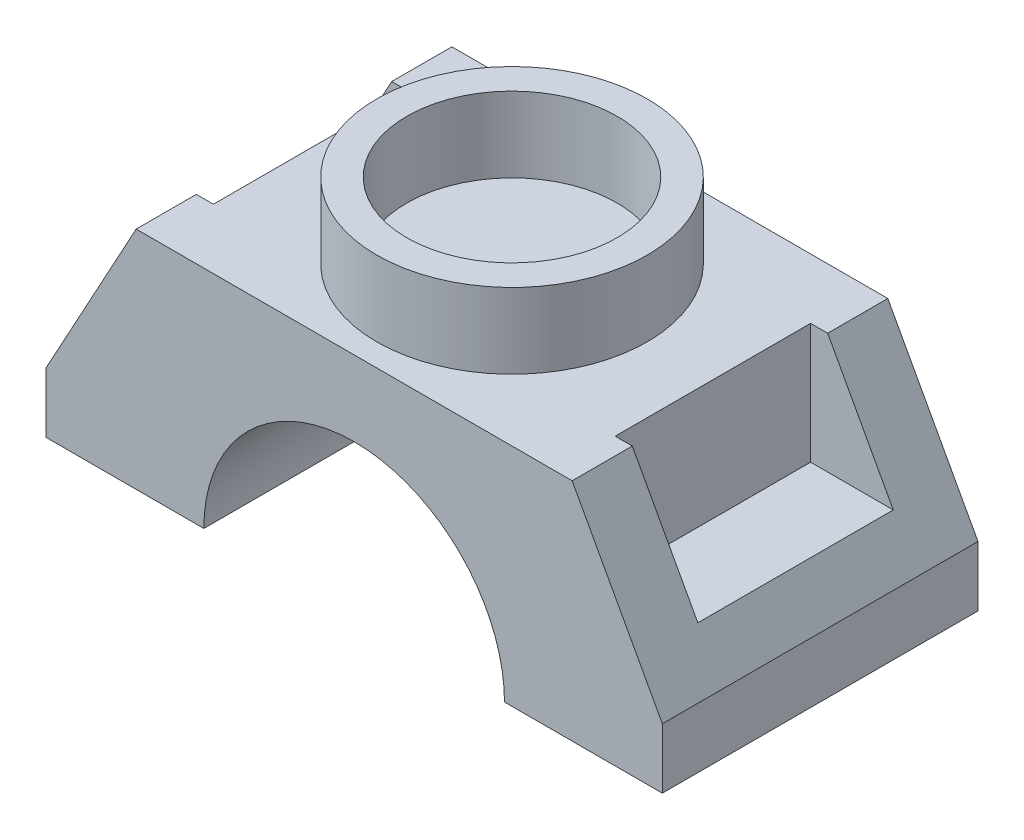
ISO-10303-21;
HEADER;
FILE_DESCRIPTION(('STEP AP214'),'2;1');
FILE_NAME('part.step','',(''),(''),'','','');
FILE_SCHEMA(('AUTOMOTIVE_DESIGN { 1 0 10303 214 1 1 1 1 }'));
ENDSEC;
DATA;
#1=APPLICATION_CONTEXT('core data for automotive mechanical design processes');
#2=APPLICATION_PROTOCOL_DEFINITION('international standard','automotive_design',2000,#1);
#3=PRODUCT_CONTEXT('',#1,'mechanical');
#4=PRODUCT('Part','Part','',(#3));
#5=PRODUCT_RELATED_PRODUCT_CATEGORY('part','',(#4));
#6=PRODUCT_DEFINITION_FORMATION('','',#4);
#7=PRODUCT_DEFINITION_CONTEXT('part definition',#1,'design');
#8=PRODUCT_DEFINITION('design','',#6,#7);
#9=PRODUCT_DEFINITION_SHAPE('','',#8);
#10=(LENGTH_UNIT() NAMED_UNIT(*) SI_UNIT(.MILLI.,.METRE.));
#11=(NAMED_UNIT(*) PLANE_ANGLE_UNIT() SI_UNIT($,.RADIAN.));
#12=(NAMED_UNIT(*) SI_UNIT($,.STERADIAN.) SOLID_ANGLE_UNIT());
#13=UNCERTAINTY_MEASURE_WITH_UNIT(LENGTH_MEASURE(1.E-05),#10,'distance_accuracy_value','');
#14=(GEOMETRIC_REPRESENTATION_CONTEXT(3) GLOBAL_UNCERTAINTY_ASSIGNED_CONTEXT((#13)) GLOBAL_UNIT_ASSIGNED_CONTEXT((#10,
#11,#12)) REPRESENTATION_CONTEXT('',''));
#15=CARTESIAN_POINT('',(0.,0.,0.));
#16=DIRECTION('',(0.,0.,1.));
#17=DIRECTION('',(1.,0.,0.));
#18=AXIS2_PLACEMENT_3D('',#15,#16,#17);
#19=CARTESIAN_POINT('',(-18.8179232783385,30.,-42.));
#20=DIRECTION('',(0.,1.,0.));
#21=DIRECTION('',(0.,0.,1.));
#22=AXIS2_PLACEMENT_3D('',#19,#20,#21);
#23=PLANE('',#22);
#24=CARTESIAN_POINT('',(10.1820767216615,30.,-21.));
#25=DIRECTION('',(0.,1.,0.));
#26=DIRECTION('',(0.,0.,1.));
#27=AXIS2_PLACEMENT_3D('',#24,#25,#26);
#28=CIRCLE('',#27,18.);
#29=CARTESIAN_POINT('',(10.1820767216615,30.,-3.00000000000001));
#30=VERTEX_POINT('',#29);
#31=EDGE_CURVE('E210',#30,#30,#28,.T.);
#32=ORIENTED_EDGE('',*,*,#31,.F.);
#33=EDGE_LOOP('',(#32));
#34=FACE_BOUND('',#33,.T.);
#35=DIRECTION('',(0.,0.,1.));
#36=VECTOR('',#35,1.);
#37=CARTESIAN_POINT('',(36.9093494489342,30.,-34.));
#38=LINE('',#37,#36);
#39=CARTESIAN_POINT('',(36.9093494489342,30.,-34.));
#40=VERTEX_POINT('',#39);
#41=CARTESIAN_POINT('',(36.9093494489342,30.,-8.));
#42=VERTEX_POINT('',#41);
#43=EDGE_CURVE('E157',#40,#42,#38,.T.);
#44=ORIENTED_EDGE('',*,*,#43,.F.);
#45=DIRECTION('',(-1.,0.,0.));
#46=VECTOR('',#45,1.);
#47=CARTESIAN_POINT('',(39.1820767216615,30.,-34.));
#48=LINE('',#47,#46);
#49=CARTESIAN_POINT('',(39.1820767216615,30.,-34.));
#50=VERTEX_POINT('',#49);
#51=EDGE_CURVE('E163',#50,#40,#48,.T.);
#52=ORIENTED_EDGE('',*,*,#51,.F.);
#53=DIRECTION('',(0.,0.,1.));
#54=VECTOR('',#53,1.);
#55=CARTESIAN_POINT('',(39.1820767216615,30.,-42.));
#56=LINE('',#55,#54);
#57=CARTESIAN_POINT('',(39.1820767216615,30.,-42.));
#58=VERTEX_POINT('',#57);
#59=EDGE_CURVE('E272',#58,#50,#56,.T.);
#60=ORIENTED_EDGE('',*,*,#59,.F.);
#61=DIRECTION('',(-1.,0.,0.));
#62=VECTOR('',#61,1.);
#63=CARTESIAN_POINT('',(-18.8179232783385,30.,-42.));
#64=LINE('',#63,#62);
#65=CARTESIAN_POINT('',(-18.8179232783385,30.,-42.));
#66=VERTEX_POINT('',#65);
#67=EDGE_CURVE('E233',#58,#66,#64,.T.);
#68=ORIENTED_EDGE('',*,*,#67,.T.);
#69=DIRECTION('',(0.,0.,1.));
#70=VECTOR('',#69,1.);
#71=CARTESIAN_POINT('',(-18.8179232783385,30.,-42.));
#72=LINE('',#71,#70);
#73=CARTESIAN_POINT('',(-18.8179232783385,30.,-34.));
#74=VERTEX_POINT('',#73);
#75=EDGE_CURVE('E268',#66,#74,#72,.T.);
#76=ORIENTED_EDGE('',*,*,#75,.T.);
#77=DIRECTION('',(-1.,0.,0.));
#78=VECTOR('',#77,1.);
#79=CARTESIAN_POINT('',(-18.8179232783385,30.,-34.));
#80=LINE('',#79,#78);
#81=CARTESIAN_POINT('',(-16.5451960056112,30.,-34.));
#82=VERTEX_POINT('',#81);
#83=EDGE_CURVE('E192',#82,#74,#80,.T.);
#84=ORIENTED_EDGE('',*,*,#83,.F.);
#85=DIRECTION('',(0.,0.,1.));
#86=VECTOR('',#85,1.);
#87=CARTESIAN_POINT('',(-16.5451960056112,30.,-34.));
#88=LINE('',#87,#86);
#89=CARTESIAN_POINT('',(-16.5451960056112,30.,-8.));
#90=VERTEX_POINT('',#89);
#91=EDGE_CURVE('E185',#82,#90,#88,.T.);
#92=ORIENTED_EDGE('',*,*,#91,.T.);
#93=DIRECTION('',(-1.,0.,0.));
#94=VECTOR('',#93,1.);
#95=CARTESIAN_POINT('',(-18.8179232783385,30.,-8.));
#96=LINE('',#95,#94);
#97=CARTESIAN_POINT('',(-18.8179232783385,30.,-8.00000000000001));
#98=VERTEX_POINT('',#97);
#99=EDGE_CURVE('E196',#90,#98,#96,.T.);
#100=ORIENTED_EDGE('',*,*,#99,.T.);
#101=CARTESIAN_POINT('',(-18.8179232783385,30.,0.));
#102=VERTEX_POINT('',#101);
#103=EDGE_CURVE('E271',#98,#102,#72,.T.);
#104=ORIENTED_EDGE('',*,*,#103,.T.);
#105=DIRECTION('',(-1.,0.,0.));
#106=VECTOR('',#105,1.);
#107=CARTESIAN_POINT('',(-18.8179232783385,30.,0.));
#108=LINE('',#107,#106);
#109=CARTESIAN_POINT('',(39.1820767216615,30.,0.));
#110=VERTEX_POINT('',#109);
#111=EDGE_CURVE('E257',#110,#102,#108,.T.);
#112=ORIENTED_EDGE('',*,*,#111,.F.);
#113=CARTESIAN_POINT('',(39.1820767216615,30.,-8.00000000000001));
#114=VERTEX_POINT('',#113);
#115=EDGE_CURVE('E274',#114,#110,#56,.T.);
#116=ORIENTED_EDGE('',*,*,#115,.F.);
#117=DIRECTION('',(-1.,0.,0.));
#118=VECTOR('',#117,1.);
#119=CARTESIAN_POINT('',(39.1820767216615,30.,-8.));
#120=LINE('',#119,#118);
#121=EDGE_CURVE('E60',#114,#42,#120,.T.);
#122=ORIENTED_EDGE('',*,*,#121,.T.);
#123=EDGE_LOOP('',(#44,#52,#60,#68,#76,#84,#92,#100,#104,#112,#116,#122));
#124=FACE_BOUND('',#123,.T.);
#125=ADVANCED_FACE('F37',(#34,#124),#23,.T.);
#126=CARTESIAN_POINT('',(39.1820767216615,30.,-42.));
#127=DIRECTION('',(0.877895572914384,0.478852130680573,0.));
#128=DIRECTION('',(-0.478852130680573,0.877895572914385,0.));
#129=AXIS2_PLACEMENT_3D('',#126,#127,#128);
#130=PLANE('',#129);
#131=ORIENTED_EDGE('',*,*,#59,.T.);
#132=DIRECTION('',(-0.478852130680573,0.877895572914384,0.));
#133=VECTOR('',#132,1.);
#134=CARTESIAN_POINT('',(47.9093494489342,14.,-34.));
#135=LINE('',#134,#133);
#136=CARTESIAN_POINT('',(47.9093494489342,14.,-34.));
#137=VERTEX_POINT('',#136);
#138=EDGE_CURVE('E168',#137,#50,#135,.T.);
#139=ORIENTED_EDGE('',*,*,#138,.F.);
#140=DIRECTION('',(0.,0.,1.));
#141=VECTOR('',#140,1.);
#142=CARTESIAN_POINT('',(47.9093494489342,14.,-34.));
#143=LINE('',#142,#141);
#144=CARTESIAN_POINT('',(47.9093494489342,14.,-8.));
#145=VERTEX_POINT('',#144);
#146=EDGE_CURVE('E175',#137,#145,#143,.T.);
#147=ORIENTED_EDGE('',*,*,#146,.T.);
#148=DIRECTION('',(-0.478852130680573,0.877895572914384,0.));
#149=VECTOR('',#148,1.);
#150=CARTESIAN_POINT('',(47.9093494489342,14.,-8.));
#151=LINE('',#150,#149);
#152=EDGE_CURVE('E171',#145,#114,#151,.T.);
#153=ORIENTED_EDGE('',*,*,#152,.T.);
#154=ORIENTED_EDGE('',*,*,#115,.T.);
#155=DIRECTION('',(-0.478852130680573,0.877895572914384,0.));
#156=VECTOR('',#155,1.);
#157=CARTESIAN_POINT('',(39.1820767216615,30.,0.));
#158=LINE('',#157,#156);
#159=CARTESIAN_POINT('',(51.1820767216615,8.,0.));
#160=VERTEX_POINT('',#159);
#161=EDGE_CURVE('E254',#160,#110,#158,.T.);
#162=ORIENTED_EDGE('',*,*,#161,.F.);
#163=DIRECTION('',(0.,0.,1.));
#164=VECTOR('',#163,1.);
#165=CARTESIAN_POINT('',(51.1820767216615,8.,-42.));
#166=LINE('',#165,#164);
#167=CARTESIAN_POINT('',(51.1820767216615,8.,-42.));
#168=VERTEX_POINT('',#167);
#169=EDGE_CURVE('E275',#168,#160,#166,.T.);
#170=ORIENTED_EDGE('',*,*,#169,.F.);
#171=DIRECTION('',(-0.478852130680573,0.877895572914384,0.));
#172=VECTOR('',#171,1.);
#173=CARTESIAN_POINT('',(39.1820767216615,30.,-42.));
#174=LINE('',#173,#172);
#175=EDGE_CURVE('E230',#168,#58,#174,.T.);
#176=ORIENTED_EDGE('',*,*,#175,.T.);
#177=EDGE_LOOP('',(#131,#139,#147,#153,#154,#162,#170,#176));
#178=FACE_BOUND('',#177,.T.);
#179=ADVANCED_FACE('F308',(#178),#130,.T.);
#180=CARTESIAN_POINT('',(-30.8179232783385,0.,-42.));
#181=DIRECTION('',(0.,-1.,0.));
#182=DIRECTION('',(0.,0.,-1.));
#183=AXIS2_PLACEMENT_3D('',#180,#181,#182);
#184=PLANE('',#183);
#185=DIRECTION('',(1.,0.,0.));
#186=VECTOR('',#185,1.);
#187=CARTESIAN_POINT('',(-30.8179232783385,0.,0.));
#188=LINE('',#187,#186);
#189=CARTESIAN_POINT('',(-30.8179232783385,0.,0.));
#190=VERTEX_POINT('',#189);
#191=CARTESIAN_POINT('',(-9.81792327833849,0.,0.));
#192=VERTEX_POINT('',#191);
#193=EDGE_CURVE('E214',#190,#192,#188,.T.);
#194=ORIENTED_EDGE('',*,*,#193,.F.);
#195=DIRECTION('',(0.,0.,1.));
#196=VECTOR('',#195,1.);
#197=CARTESIAN_POINT('',(-30.8179232783385,0.,-42.));
#198=LINE('',#197,#196);
#199=CARTESIAN_POINT('',(-30.8179232783385,0.,-42.));
#200=VERTEX_POINT('',#199);
#201=EDGE_CURVE('E45',#200,#190,#198,.T.);
#202=ORIENTED_EDGE('',*,*,#201,.F.);
#203=DIRECTION('',(1.,0.,0.));
#204=VECTOR('',#203,1.);
#205=CARTESIAN_POINT('',(-30.8179232783385,0.,-42.));
#206=LINE('',#205,#204);
#207=CARTESIAN_POINT('',(-9.81792327833849,0.,-42.));
#208=VERTEX_POINT('',#207);
#209=EDGE_CURVE('E217',#200,#208,#206,.T.);
#210=ORIENTED_EDGE('',*,*,#209,.T.);
#211=DIRECTION('',(0.,0.,1.));
#212=VECTOR('',#211,1.);
#213=CARTESIAN_POINT('',(-9.81792327833849,0.,-42.));
#214=LINE('',#213,#212);
#215=EDGE_CURVE('E242',#208,#192,#214,.T.);
#216=ORIENTED_EDGE('',*,*,#215,.T.);
#217=EDGE_LOOP('',(#194,#202,#210,#216));
#218=FACE_BOUND('',#217,.T.);
#219=ADVANCED_FACE('F39',(#218),#184,.T.);
#220=CARTESIAN_POINT('',(-30.8179232783385,0.,-42.));
#221=DIRECTION('',(-1.,0.,0.));
#222=DIRECTION('',(0.,-1.,0.));
#223=AXIS2_PLACEMENT_3D('',#220,#221,#222);
#224=PLANE('',#223);
#225=DIRECTION('',(0.,-1.,0.));
#226=VECTOR('',#225,1.);
#227=CARTESIAN_POINT('',(-30.8179232783385,0.,0.));
#228=LINE('',#227,#226);
#229=CARTESIAN_POINT('',(-30.8179232783385,8.,0.));
#230=VERTEX_POINT('',#229);
#231=EDGE_CURVE('E221',#230,#190,#228,.T.);
#232=ORIENTED_EDGE('',*,*,#231,.F.);
#233=DIRECTION('',(0.,0.,1.));
#234=VECTOR('',#233,1.);
#235=CARTESIAN_POINT('',(-30.8179232783385,8.,-42.));
#236=LINE('',#235,#234);
#237=CARTESIAN_POINT('',(-30.8179232783385,8.,-42.));
#238=VERTEX_POINT('',#237);
#239=EDGE_CURVE('E266',#238,#230,#236,.T.);
#240=ORIENTED_EDGE('',*,*,#239,.F.);
#241=DIRECTION('',(0.,-1.,0.));
#242=VECTOR('',#241,1.);
#243=CARTESIAN_POINT('',(-30.8179232783385,0.,-42.));
#244=LINE('',#243,#242);
#245=EDGE_CURVE('E239',#238,#200,#244,.T.);
#246=ORIENTED_EDGE('',*,*,#245,.T.);
#247=ORIENTED_EDGE('',*,*,#201,.T.);
#248=EDGE_LOOP('',(#232,#240,#246,#247));
#249=FACE_BOUND('',#248,.T.);
#250=ADVANCED_FACE('F293',(#249),#224,.T.);
#251=CARTESIAN_POINT('',(-30.8179232783385,8.,-42.));
#252=DIRECTION('',(-0.877895572914384,0.478852130680573,0.));
#253=DIRECTION('',(-0.478852130680573,-0.877895572914384,0.));
#254=AXIS2_PLACEMENT_3D('',#251,#252,#253);
#255=PLANE('',#254);
#256=DIRECTION('',(-0.478852130680573,-0.877895572914384,0.));
#257=VECTOR('',#256,1.);
#258=CARTESIAN_POINT('',(-27.5451960056112,14.,-34.));
#259=LINE('',#258,#257);
#260=CARTESIAN_POINT('',(-27.5451960056112,14.,-34.));
#261=VERTEX_POINT('',#260);
#262=EDGE_CURVE('E203',#74,#261,#259,.T.);
#263=ORIENTED_EDGE('',*,*,#262,.F.);
#264=ORIENTED_EDGE('',*,*,#75,.F.);
#265=DIRECTION('',(-0.478852130680573,-0.877895572914384,0.));
#266=VECTOR('',#265,1.);
#267=CARTESIAN_POINT('',(-30.8179232783385,8.,-42.));
#268=LINE('',#267,#266);
#269=EDGE_CURVE('E236',#66,#238,#268,.T.);
#270=ORIENTED_EDGE('',*,*,#269,.T.);
#271=ORIENTED_EDGE('',*,*,#239,.T.);
#272=DIRECTION('',(-0.478852130680573,-0.877895572914384,0.));
#273=VECTOR('',#272,1.);
#274=CARTESIAN_POINT('',(-30.8179232783385,8.,0.));
#275=LINE('',#274,#273);
#276=EDGE_CURVE('E260',#102,#230,#275,.T.);
#277=ORIENTED_EDGE('',*,*,#276,.F.);
#278=ORIENTED_EDGE('',*,*,#103,.F.);
#279=DIRECTION('',(-0.478852130680573,-0.877895572914384,0.));
#280=VECTOR('',#279,1.);
#281=CARTESIAN_POINT('',(-27.5451960056112,14.,-8.));
#282=LINE('',#281,#280);
#283=CARTESIAN_POINT('',(-27.5451960056112,14.,-8.));
#284=VERTEX_POINT('',#283);
#285=EDGE_CURVE('E52',#98,#284,#282,.T.);
#286=ORIENTED_EDGE('',*,*,#285,.T.);
#287=DIRECTION('',(0.,0.,1.));
#288=VECTOR('',#287,1.);
#289=CARTESIAN_POINT('',(-27.5451960056112,14.,-34.));
#290=LINE('',#289,#288);
#291=EDGE_CURVE('E180',#261,#284,#290,.T.);
#292=ORIENTED_EDGE('',*,*,#291,.F.);
#293=EDGE_LOOP('',(#263,#264,#270,#271,#277,#278,#286,#292));
#294=FACE_BOUND('',#293,.T.);
#295=ADVANCED_FACE('F314',(#294),#255,.T.);
#296=CARTESIAN_POINT('',(51.1820767216615,8.,-42.));
#297=DIRECTION('',(1.,0.,0.));
#298=DIRECTION('',(0.,0.,-1.));
#299=AXIS2_PLACEMENT_3D('',#296,#297,#298);
#300=PLANE('',#299);
#301=DIRECTION('',(0.,1.,0.));
#302=VECTOR('',#301,1.);
#303=CARTESIAN_POINT('',(51.1820767216615,8.,0.));
#304=LINE('',#303,#302);
#305=CARTESIAN_POINT('',(51.1820767216615,0.,0.));
#306=VERTEX_POINT('',#305);
#307=EDGE_CURVE('E251',#306,#160,#304,.T.);
#308=ORIENTED_EDGE('',*,*,#307,.F.);
#309=DIRECTION('',(0.,0.,1.));
#310=VECTOR('',#309,1.);
#311=CARTESIAN_POINT('',(51.1820767216615,0.,-42.));
#312=LINE('',#311,#310);
#313=CARTESIAN_POINT('',(51.1820767216615,0.,-42.));
#314=VERTEX_POINT('',#313);
#315=EDGE_CURVE('E277',#314,#306,#312,.T.);
#316=ORIENTED_EDGE('',*,*,#315,.F.);
#317=DIRECTION('',(0.,1.,0.));
#318=VECTOR('',#317,1.);
#319=CARTESIAN_POINT('',(51.1820767216615,8.,-42.));
#320=LINE('',#319,#318);
#321=EDGE_CURVE('E227',#314,#168,#320,.T.);
#322=ORIENTED_EDGE('',*,*,#321,.T.);
#323=ORIENTED_EDGE('',*,*,#169,.T.);
#324=EDGE_LOOP('',(#308,#316,#322,#323));
#325=FACE_BOUND('',#324,.T.);
#326=ADVANCED_FACE('F306',(#325),#300,.T.);
#327=CARTESIAN_POINT('',(30.1820767216615,0.,-42.));
#328=DIRECTION('',(0.,-1.,0.));
#329=DIRECTION('',(0.,0.,-1.));
#330=AXIS2_PLACEMENT_3D('',#327,#328,#329);
#331=PLANE('',#330);
#332=DIRECTION('',(1.,0.,0.));
#333=VECTOR('',#332,1.);
#334=CARTESIAN_POINT('',(30.1820767216615,0.,0.));
#335=LINE('',#334,#333);
#336=CARTESIAN_POINT('',(30.1820767216615,0.,0.));
#337=VERTEX_POINT('',#336);
#338=EDGE_CURVE('E248',#337,#306,#335,.T.);
#339=ORIENTED_EDGE('',*,*,#338,.F.);
#340=DIRECTION('',(0.,0.,1.));
#341=VECTOR('',#340,1.);
#342=CARTESIAN_POINT('',(30.1820767216615,0.,-42.));
#343=LINE('',#342,#341);
#344=CARTESIAN_POINT('',(30.1820767216615,0.,-42.));
#345=VERTEX_POINT('',#344);
#346=EDGE_CURVE('E279',#345,#337,#343,.T.);
#347=ORIENTED_EDGE('',*,*,#346,.F.);
#348=DIRECTION('',(1.,0.,0.));
#349=VECTOR('',#348,1.);
#350=CARTESIAN_POINT('',(30.1820767216615,0.,-42.));
#351=LINE('',#350,#349);
#352=EDGE_CURVE('E224',#345,#314,#351,.T.);
#353=ORIENTED_EDGE('',*,*,#352,.T.);
#354=ORIENTED_EDGE('',*,*,#315,.T.);
#355=EDGE_LOOP('',(#339,#347,#353,#354));
#356=FACE_BOUND('',#355,.T.);
#357=ADVANCED_FACE('F302',(#356),#331,.T.);
#358=CARTESIAN_POINT('',(10.1820767216615,0.,-42.));
#359=DIRECTION('',(0.,0.,1.));
#360=DIRECTION('',(1.,0.,0.));
#361=AXIS2_PLACEMENT_3D('',#358,#359,#360);
#362=CYLINDRICAL_SURFACE('',#361,20.);
#363=CARTESIAN_POINT('',(10.1820767216615,0.,0.));
#364=DIRECTION('',(0.,0.,-1.));
#365=DIRECTION('',(-1.,0.,0.));
#366=AXIS2_PLACEMENT_3D('',#363,#364,#365);
#367=CIRCLE('',#366,20.);
#368=EDGE_CURVE('E245',#192,#337,#367,.T.);
#369=ORIENTED_EDGE('',*,*,#368,.F.);
#370=ORIENTED_EDGE('',*,*,#215,.F.);
#371=CARTESIAN_POINT('',(10.1820767216615,0.,-42.));
#372=DIRECTION('',(0.,0.,-1.));
#373=DIRECTION('',(-1.,0.,0.));
#374=AXIS2_PLACEMENT_3D('',#371,#372,#373);
#375=CIRCLE('',#374,20.);
#376=EDGE_CURVE('E220',#208,#345,#375,.T.);
#377=ORIENTED_EDGE('',*,*,#376,.T.);
#378=ORIENTED_EDGE('',*,*,#346,.T.);
#379=EDGE_LOOP('',(#369,#370,#377,#378));
#380=FACE_BOUND('',#379,.T.);
#381=ADVANCED_FACE('F286',(#380),#362,.F.);
#382=CARTESIAN_POINT('',(10.1820767216615,0.,-42.));
#383=DIRECTION('',(0.,0.,-1.));
#384=DIRECTION('',(-1.,0.,0.));
#385=AXIS2_PLACEMENT_3D('',#382,#383,#384);
#386=PLANE('',#385);
#387=ORIENTED_EDGE('',*,*,#209,.F.);
#388=ORIENTED_EDGE('',*,*,#245,.F.);
#389=ORIENTED_EDGE('',*,*,#269,.F.);
#390=ORIENTED_EDGE('',*,*,#67,.F.);
#391=ORIENTED_EDGE('',*,*,#175,.F.);
#392=ORIENTED_EDGE('',*,*,#321,.F.);
#393=ORIENTED_EDGE('',*,*,#352,.F.);
#394=ORIENTED_EDGE('',*,*,#376,.F.);
#395=EDGE_LOOP('',(#387,#388,#389,#390,#391,#392,#393,#394));
#396=FACE_BOUND('',#395,.T.);
#397=ADVANCED_FACE('F296',(#396),#386,.T.);
#398=CARTESIAN_POINT('',(10.1820767216615,0.,0.));
#399=DIRECTION('',(0.,0.,-1.));
#400=DIRECTION('',(-1.,0.,0.));
#401=AXIS2_PLACEMENT_3D('',#398,#399,#400);
#402=PLANE('',#401);
#403=ORIENTED_EDGE('',*,*,#193,.T.);
#404=ORIENTED_EDGE('',*,*,#368,.T.);
#405=ORIENTED_EDGE('',*,*,#338,.T.);
#406=ORIENTED_EDGE('',*,*,#307,.T.);
#407=ORIENTED_EDGE('',*,*,#161,.T.);
#408=ORIENTED_EDGE('',*,*,#111,.T.);
#409=ORIENTED_EDGE('',*,*,#276,.T.);
#410=ORIENTED_EDGE('',*,*,#231,.T.);
#411=EDGE_LOOP('',(#403,#404,#405,#406,#407,#408,#409,#410));
#412=FACE_BOUND('',#411,.T.);
#413=ADVANCED_FACE('F289',(#412),#402,.F.);
#414=CARTESIAN_POINT('',(10.1820767216615,40.,-21.));
#415=DIRECTION('',(0.,1.,0.));
#416=DIRECTION('',(0.,0.,1.));
#417=AXIS2_PLACEMENT_3D('',#414,#415,#416);
#418=PLANE('',#417);
#419=CARTESIAN_POINT('',(10.1820767216615,40.,-21.));
#420=DIRECTION('',(0.,1.,0.));
#421=DIRECTION('',(0.,0.,1.));
#422=AXIS2_PLACEMENT_3D('',#419,#420,#421);
#423=CIRCLE('',#422,18.);
#424=CARTESIAN_POINT('',(10.1820767216615,40.,-3.00000000000001));
#425=VERTEX_POINT('',#424);
#426=EDGE_CURVE('E211',#425,#425,#423,.T.);
#427=ORIENTED_EDGE('',*,*,#426,.T.);
#428=EDGE_LOOP('',(#427));
#429=FACE_BOUND('',#428,.T.);
#430=CARTESIAN_POINT('',(10.1820767216615,40.,-21.));
#431=DIRECTION('',(0.,1.,0.));
#432=DIRECTION('',(0.,0.,1.));
#433=AXIS2_PLACEMENT_3D('',#430,#431,#432);
#434=CIRCLE('',#433,14.);
#435=CARTESIAN_POINT('',(10.1820767216615,40.,-7.));
#436=VERTEX_POINT('',#435);
#437=EDGE_CURVE('E207',#436,#436,#434,.T.);
#438=ORIENTED_EDGE('',*,*,#437,.F.);
#439=EDGE_LOOP('',(#438));
#440=FACE_BOUND('',#439,.T.);
#441=ADVANCED_FACE('F365',(#429,#440),#418,.T.);
#442=CARTESIAN_POINT('',(10.1820767216615,40.,-21.));
#443=DIRECTION('',(0.,-1.,0.));
#444=DIRECTION('',(0.,0.,-1.));
#445=AXIS2_PLACEMENT_3D('',#442,#443,#444);
#446=CYLINDRICAL_SURFACE('',#445,18.);
#447=ORIENTED_EDGE('',*,*,#426,.F.);
#448=EDGE_LOOP('',(#447));
#449=FACE_BOUND('',#448,.T.);
#450=ORIENTED_EDGE('',*,*,#31,.T.);
#451=EDGE_LOOP('',(#450));
#452=FACE_BOUND('',#451,.T.);
#453=ADVANCED_FACE('F357',(#449,#452),#446,.T.);
#454=CARTESIAN_POINT('',(10.1820767216615,40.,-21.));
#455=DIRECTION('',(0.,-1.,0.));
#456=DIRECTION('',(0.,0.,-1.));
#457=AXIS2_PLACEMENT_3D('',#454,#455,#456);
#458=CYLINDRICAL_SURFACE('',#457,14.);
#459=ORIENTED_EDGE('',*,*,#437,.T.);
#460=EDGE_LOOP('',(#459));
#461=FACE_BOUND('',#460,.T.);
#462=CARTESIAN_POINT('',(10.1820767216615,30.,-21.));
#463=DIRECTION('',(0.,1.,0.));
#464=DIRECTION('',(0.,0.,1.));
#465=AXIS2_PLACEMENT_3D('',#462,#463,#464);
#466=CIRCLE('',#465,14.);
#467=CARTESIAN_POINT('',(10.1820767216615,30.,-7.));
#468=VERTEX_POINT('',#467);
#469=EDGE_CURVE('E11',#468,#468,#466,.F.);
#470=ORIENTED_EDGE('',*,*,#469,.T.);
#471=EDGE_LOOP('',(#470));
#472=FACE_BOUND('',#471,.T.);
#473=ADVANCED_FACE('F351',(#461,#472),#458,.F.);
#474=ORIENTED_EDGE('',*,*,#469,.F.);
#475=EDGE_LOOP('',(#474));
#476=FACE_BOUND('',#475,.T.);
#477=ADVANCED_FACE('F343',(#476),#23,.T.);
#478=CARTESIAN_POINT('',(36.9093494489342,14.,-34.));
#479=DIRECTION('',(0.,-1.,0.));
#480=DIRECTION('',(0.,0.,-1.));
#481=AXIS2_PLACEMENT_3D('',#478,#479,#480);
#482=PLANE('',#481);
#483=DIRECTION('',(1.,0.,0.));
#484=VECTOR('',#483,1.);
#485=CARTESIAN_POINT('',(36.9093494489342,14.,-8.));
#486=LINE('',#485,#484);
#487=CARTESIAN_POINT('',(36.9093494489342,14.,-8.));
#488=VERTEX_POINT('',#487);
#489=EDGE_CURVE('E320',#488,#145,#486,.T.);
#490=ORIENTED_EDGE('',*,*,#489,.T.);
#491=ORIENTED_EDGE('',*,*,#146,.F.);
#492=DIRECTION('',(1.,0.,0.));
#493=VECTOR('',#492,1.);
#494=CARTESIAN_POINT('',(36.9093494489342,14.,-34.));
#495=LINE('',#494,#493);
#496=CARTESIAN_POINT('',(36.9093494489342,14.,-34.));
#497=VERTEX_POINT('',#496);
#498=EDGE_CURVE('E162',#497,#137,#495,.T.);
#499=ORIENTED_EDGE('',*,*,#498,.F.);
#500=DIRECTION('',(0.,0.,1.));
#501=VECTOR('',#500,1.);
#502=CARTESIAN_POINT('',(36.9093494489342,14.,-34.));
#503=LINE('',#502,#501);
#504=EDGE_CURVE('E158',#497,#488,#503,.T.);
#505=ORIENTED_EDGE('',*,*,#504,.T.);
#506=EDGE_LOOP('',(#490,#491,#499,#505));
#507=FACE_BOUND('',#506,.T.);
#508=ADVANCED_FACE('F325',(#507),#482,.F.);
#509=CARTESIAN_POINT('',(36.9093494489342,30.,-34.));
#510=DIRECTION('',(-1.,0.,0.));
#511=DIRECTION('',(0.,0.,1.));
#512=AXIS2_PLACEMENT_3D('',#509,#510,#511);
#513=PLANE('',#512);
#514=DIRECTION('',(0.,-1.,0.));
#515=VECTOR('',#514,1.);
#516=CARTESIAN_POINT('',(36.9093494489342,30.,-8.));
#517=LINE('',#516,#515);
#518=EDGE_CURVE('E322',#42,#488,#517,.T.);
#519=ORIENTED_EDGE('',*,*,#518,.T.);
#520=ORIENTED_EDGE('',*,*,#504,.F.);
#521=DIRECTION('',(0.,-1.,0.));
#522=VECTOR('',#521,1.);
#523=CARTESIAN_POINT('',(36.9093494489342,30.,-34.));
#524=LINE('',#523,#522);
#525=EDGE_CURVE('E152',#40,#497,#524,.T.);
#526=ORIENTED_EDGE('',*,*,#525,.F.);
#527=ORIENTED_EDGE('',*,*,#43,.T.);
#528=EDGE_LOOP('',(#519,#520,#526,#527));
#529=FACE_BOUND('',#528,.T.);
#530=ADVANCED_FACE('F155',(#529),#513,.F.);
#531=CARTESIAN_POINT('',(0.,0.,-34.));
#532=DIRECTION('',(0.,0.,1.));
#533=DIRECTION('',(1.,0.,0.));
#534=AXIS2_PLACEMENT_3D('',#531,#532,#533);
#535=PLANE('',#534);
#536=ORIENTED_EDGE('',*,*,#51,.T.);
#537=ORIENTED_EDGE('',*,*,#525,.T.);
#538=ORIENTED_EDGE('',*,*,#498,.T.);
#539=ORIENTED_EDGE('',*,*,#138,.T.);
#540=EDGE_LOOP('',(#536,#537,#538,#539));
#541=FACE_BOUND('',#540,.T.);
#542=ADVANCED_FACE('F166',(#541),#535,.T.);
#543=CARTESIAN_POINT('',(0.,0.,-8.));
#544=DIRECTION('',(0.,0.,1.));
#545=DIRECTION('',(1.,0.,0.));
#546=AXIS2_PLACEMENT_3D('',#543,#544,#545);
#547=PLANE('',#546);
#548=ORIENTED_EDGE('',*,*,#121,.F.);
#549=ORIENTED_EDGE('',*,*,#152,.F.);
#550=ORIENTED_EDGE('',*,*,#489,.F.);
#551=ORIENTED_EDGE('',*,*,#518,.F.);
#552=EDGE_LOOP('',(#548,#549,#550,#551));
#553=FACE_BOUND('',#552,.T.);
#554=ADVANCED_FACE('F327',(#553),#547,.F.);
#555=CARTESIAN_POINT('',(-16.5451960056112,30.,-34.));
#556=DIRECTION('',(1.,0.,0.));
#557=DIRECTION('',(0.,1.,0.));
#558=AXIS2_PLACEMENT_3D('',#555,#556,#557);
#559=PLANE('',#558);
#560=DIRECTION('',(0.,1.,0.));
#561=VECTOR('',#560,1.);
#562=CARTESIAN_POINT('',(-16.5451960056112,30.,-8.));
#563=LINE('',#562,#561);
#564=CARTESIAN_POINT('',(-16.5451960056112,14.,-8.));
#565=VERTEX_POINT('',#564);
#566=EDGE_CURVE('E188',#565,#90,#563,.T.);
#567=ORIENTED_EDGE('',*,*,#566,.T.);
#568=ORIENTED_EDGE('',*,*,#91,.F.);
#569=DIRECTION('',(0.,1.,0.));
#570=VECTOR('',#569,1.);
#571=CARTESIAN_POINT('',(-16.5451960056112,30.,-34.));
#572=LINE('',#571,#570);
#573=CARTESIAN_POINT('',(-16.5451960056112,14.,-34.));
#574=VERTEX_POINT('',#573);
#575=EDGE_CURVE('E182',#574,#82,#572,.T.);
#576=ORIENTED_EDGE('',*,*,#575,.F.);
#577=DIRECTION('',(0.,0.,1.));
#578=VECTOR('',#577,1.);
#579=CARTESIAN_POINT('',(-16.5451960056112,14.,-34.));
#580=LINE('',#579,#578);
#581=EDGE_CURVE('E183',#574,#565,#580,.T.);
#582=ORIENTED_EDGE('',*,*,#581,.T.);
#583=EDGE_LOOP('',(#567,#568,#576,#582));
#584=FACE_BOUND('',#583,.T.);
#585=ADVANCED_FACE('F329',(#584),#559,.F.);
#586=CARTESIAN_POINT('',(-16.5451960056112,14.,-34.));
#587=DIRECTION('',(0.,-1.,0.));
#588=DIRECTION('',(1.,0.,0.));
#589=AXIS2_PLACEMENT_3D('',#586,#587,#588);
#590=PLANE('',#589);
#591=DIRECTION('',(1.,0.,0.));
#592=VECTOR('',#591,1.);
#593=CARTESIAN_POINT('',(-16.5451960056112,14.,-8.));
#594=LINE('',#593,#592);
#595=EDGE_CURVE('E191',#284,#565,#594,.T.);
#596=ORIENTED_EDGE('',*,*,#595,.T.);
#597=ORIENTED_EDGE('',*,*,#581,.F.);
#598=DIRECTION('',(1.,0.,0.));
#599=VECTOR('',#598,1.);
#600=CARTESIAN_POINT('',(-16.5451960056112,14.,-34.));
#601=LINE('',#600,#599);
#602=EDGE_CURVE('E200',#261,#574,#601,.T.);
#603=ORIENTED_EDGE('',*,*,#602,.F.);
#604=ORIENTED_EDGE('',*,*,#291,.T.);
#605=EDGE_LOOP('',(#596,#597,#603,#604));
#606=FACE_BOUND('',#605,.T.);
#607=ADVANCED_FACE('F335',(#606),#590,.F.);
#608=CARTESIAN_POINT('',(0.,0.,-34.));
#609=DIRECTION('',(0.,0.,-1.));
#610=DIRECTION('',(-1.,0.,0.));
#611=AXIS2_PLACEMENT_3D('',#608,#609,#610);
#612=PLANE('',#611);
#613=ORIENTED_EDGE('',*,*,#83,.T.);
#614=ORIENTED_EDGE('',*,*,#262,.T.);
#615=ORIENTED_EDGE('',*,*,#602,.T.);
#616=ORIENTED_EDGE('',*,*,#575,.T.);
#617=EDGE_LOOP('',(#613,#614,#615,#616));
#618=FACE_BOUND('',#617,.T.);
#619=ADVANCED_FACE('F370',(#618),#612,.F.);
#620=CARTESIAN_POINT('',(0.,0.,-8.));
#621=DIRECTION('',(0.,0.,-1.));
#622=DIRECTION('',(-1.,0.,0.));
#623=AXIS2_PLACEMENT_3D('',#620,#621,#622);
#624=PLANE('',#623);
#625=ORIENTED_EDGE('',*,*,#99,.F.);
#626=ORIENTED_EDGE('',*,*,#566,.F.);
#627=ORIENTED_EDGE('',*,*,#595,.F.);
#628=ORIENTED_EDGE('',*,*,#285,.F.);
#629=EDGE_LOOP('',(#625,#626,#627,#628));
#630=FACE_BOUND('',#629,.T.);
#631=ADVANCED_FACE('F494',(#630),#624,.T.);
#632=CLOSED_SHELL('',(#125,#179,#219,#250,#295,#326,#357,#381,#397,#413,#441,#453,#473,#477,
#508,#530,#542,#554,#585,#607,#619,#631));
#633=MANIFOLD_SOLID_BREP('B2',#632);
#634=ADVANCED_BREP_SHAPE_REPRESENTATION('',(#18,#633),#14);
#635=SHAPE_DEFINITION_REPRESENTATION(#9,#634);
ENDSEC;
END-ISO-10303-21;
